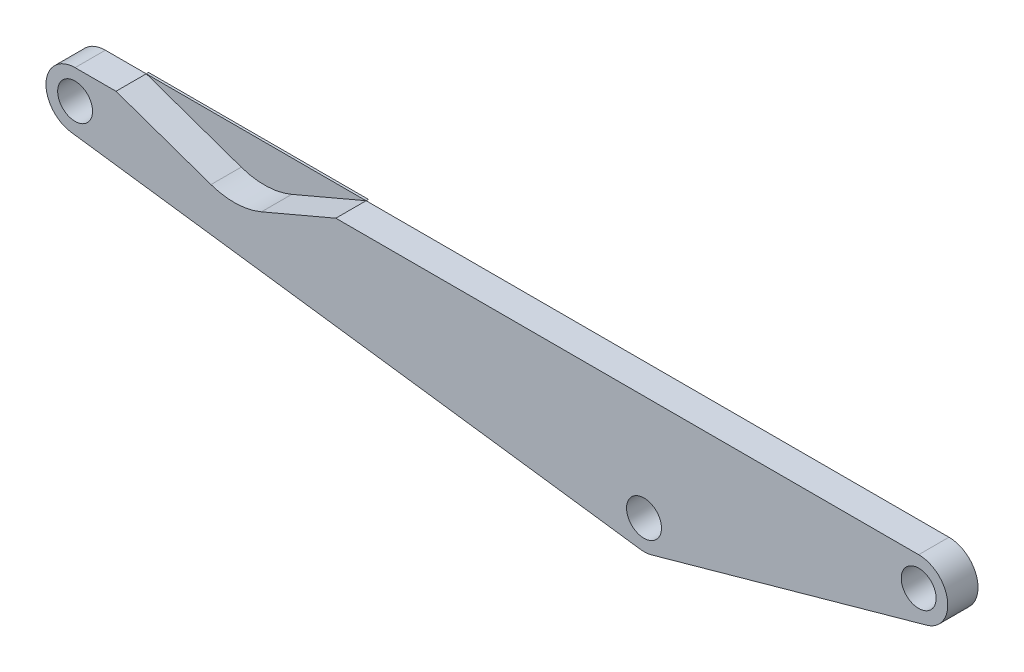
ISO-10303-21;
HEADER;
FILE_DESCRIPTION(('STEP AP214'),'2;1');
FILE_NAME('part.step','',(''),(''),'','','');
FILE_SCHEMA(('AUTOMOTIVE_DESIGN { 1 0 10303 214 1 1 1 1 }'));
ENDSEC;
DATA;
#1=APPLICATION_CONTEXT('core data for automotive mechanical design processes');
#2=APPLICATION_PROTOCOL_DEFINITION('international standard','automotive_design',2000,#1);
#3=PRODUCT_CONTEXT('',#1,'mechanical');
#4=PRODUCT('Part','Part','',(#3));
#5=PRODUCT_RELATED_PRODUCT_CATEGORY('part','',(#4));
#6=PRODUCT_DEFINITION_FORMATION('','',#4);
#7=PRODUCT_DEFINITION_CONTEXT('part definition',#1,'design');
#8=PRODUCT_DEFINITION('design','',#6,#7);
#9=PRODUCT_DEFINITION_SHAPE('','',#8);
#10=(LENGTH_UNIT() NAMED_UNIT(*) SI_UNIT(.MILLI.,.METRE.));
#11=(NAMED_UNIT(*) PLANE_ANGLE_UNIT() SI_UNIT($,.RADIAN.));
#12=(NAMED_UNIT(*) SI_UNIT($,.STERADIAN.) SOLID_ANGLE_UNIT());
#13=UNCERTAINTY_MEASURE_WITH_UNIT(LENGTH_MEASURE(1.E-05),#10,'distance_accuracy_value','');
#14=(GEOMETRIC_REPRESENTATION_CONTEXT(3) GLOBAL_UNCERTAINTY_ASSIGNED_CONTEXT((#13)) GLOBAL_UNIT_ASSIGNED_CONTEXT((#10,
#11,#12)) REPRESENTATION_CONTEXT('',''));
#15=CARTESIAN_POINT('',(0.,0.,0.));
#16=DIRECTION('',(0.,0.,1.));
#17=DIRECTION('',(1.,0.,0.));
#18=AXIS2_PLACEMENT_3D('',#15,#16,#17);
#19=CARTESIAN_POINT('',(1.75732914672943,1.25,-0.75));
#20=DIRECTION('',(0.,-1.,0.));
#21=DIRECTION('',(0.,0.,-1.));
#22=AXIS2_PLACEMENT_3D('',#19,#20,#21);
#23=PLANE('',#22);
#24=DIRECTION('',(1.,0.,0.));
#25=VECTOR('',#24,1.);
#26=CARTESIAN_POINT('',(1.75732914672943,1.25,-0.65));
#27=LINE('',#26,#25);
#28=CARTESIAN_POINT('',(1.75732914672943,1.25,-0.65));
#29=VERTEX_POINT('',#28);
#30=CARTESIAN_POINT('',(11.2021113101362,1.25,-0.65));
#31=VERTEX_POINT('',#30);
#32=EDGE_CURVE('E106',#29,#31,#27,.T.);
#33=ORIENTED_EDGE('',*,*,#32,.T.);
#34=DIRECTION('',(0.,0.,1.));
#35=VECTOR('',#34,1.);
#36=CARTESIAN_POINT('',(11.2021113101362,1.25,-0.75));
#37=LINE('',#36,#35);
#38=CARTESIAN_POINT('',(11.2021113101362,1.25,-0.75));
#39=VERTEX_POINT('',#38);
#40=EDGE_CURVE('E12',#39,#31,#37,.T.);
#41=ORIENTED_EDGE('',*,*,#40,.F.);
#42=DIRECTION('',(1.,0.,0.));
#43=VECTOR('',#42,1.);
#44=CARTESIAN_POINT('',(1.75732914672943,1.25,-0.75));
#45=LINE('',#44,#43);
#46=CARTESIAN_POINT('',(1.75732914672943,1.25,-0.75));
#47=VERTEX_POINT('',#46);
#48=EDGE_CURVE('E94',#47,#39,#45,.T.);
#49=ORIENTED_EDGE('',*,*,#48,.F.);
#50=DIRECTION('',(0.,0.,1.));
#51=VECTOR('',#50,1.);
#52=CARTESIAN_POINT('',(1.75732914672943,1.25,-0.75));
#53=LINE('',#52,#51);
#54=EDGE_CURVE('E102',#47,#29,#53,.T.);
#55=ORIENTED_EDGE('',*,*,#54,.T.);
#56=EDGE_LOOP('',(#33,#41,#49,#55));
#57=FACE_BOUND('',#56,.T.);
#58=ADVANCED_FACE('F43',(#57),#23,.F.);
#59=CARTESIAN_POINT('',(8.00623029335462,-0.111228877408158,-0.75));
#60=DIRECTION('',(-0.391867010734309,0.920021872510734,0.));
#61=DIRECTION('',(-0.920021872510734,-0.391867010734309,0.));
#62=AXIS2_PLACEMENT_3D('',#59,#60,#61);
#63=PLANE('',#62);
#64=DIRECTION('',(-0.920021872510734,-0.391867010734309,0.));
#65=VECTOR('',#64,1.);
#66=CARTESIAN_POINT('',(8.00623029335462,-0.111228877408158,-0.65));
#67=LINE('',#66,#65);
#68=CARTESIAN_POINT('',(8.00623029335462,-0.111228877408158,-0.65));
#69=VERTEX_POINT('',#68);
#70=EDGE_CURVE('E98',#31,#69,#67,.T.);
#71=ORIENTED_EDGE('',*,*,#70,.T.);
#72=DIRECTION('',(0.,0.,1.));
#73=VECTOR('',#72,1.);
#74=CARTESIAN_POINT('',(8.00623029335462,-0.111228877408158,-0.75));
#75=LINE('',#74,#73);
#76=CARTESIAN_POINT('',(8.00623029335462,-0.111228877408158,-0.75));
#77=VERTEX_POINT('',#76);
#78=EDGE_CURVE('E51',#77,#69,#75,.T.);
#79=ORIENTED_EDGE('',*,*,#78,.F.);
#80=DIRECTION('',(-0.920021872510734,-0.391867010734309,0.));
#81=VECTOR('',#80,1.);
#82=CARTESIAN_POINT('',(8.00623029335462,-0.111228877408158,-0.75));
#83=LINE('',#82,#81);
#84=EDGE_CURVE('E89',#39,#77,#83,.T.);
#85=ORIENTED_EDGE('',*,*,#84,.F.);
#86=ORIENTED_EDGE('',*,*,#40,.T.);
#87=EDGE_LOOP('',(#71,#79,#85,#86));
#88=FACE_BOUND('',#87,.T.);
#89=ADVANCED_FACE('F97',(#88),#63,.F.);
#90=CARTESIAN_POINT('',(6.83062926115168,2.64883674012404,-0.75));
#91=DIRECTION('',(0.,0.,1.));
#92=DIRECTION('',(1.,0.,0.));
#93=AXIS2_PLACEMENT_3D('',#90,#91,#92);
#94=CYLINDRICAL_SURFACE('',#93,3.);
#95=CARTESIAN_POINT('',(6.83062926115168,2.64883674012404,-0.65));
#96=DIRECTION('',(0.,0.,-1.));
#97=DIRECTION('',(-1.,0.,0.));
#98=AXIS2_PLACEMENT_3D('',#95,#96,#97);
#99=CIRCLE('',#98,3.);
#100=CARTESIAN_POINT('',(5.83713675970931,-0.181882717819079,-0.65));
#101=VERTEX_POINT('',#100);
#102=EDGE_CURVE('E76',#69,#101,#99,.T.);
#103=ORIENTED_EDGE('',*,*,#102,.T.);
#104=DIRECTION('',(0.,0.,1.));
#105=VECTOR('',#104,1.);
#106=CARTESIAN_POINT('',(5.83713675970931,-0.181882717819079,-0.75));
#107=LINE('',#106,#105);
#108=CARTESIAN_POINT('',(5.83713675970931,-0.181882717819079,-0.75));
#109=VERTEX_POINT('',#108);
#110=EDGE_CURVE('E99',#109,#101,#107,.T.);
#111=ORIENTED_EDGE('',*,*,#110,.F.);
#112=CARTESIAN_POINT('',(6.83062926115168,2.64883674012404,-0.75));
#113=DIRECTION('',(0.,0.,-1.));
#114=DIRECTION('',(-1.,0.,0.));
#115=AXIS2_PLACEMENT_3D('',#112,#113,#114);
#116=CIRCLE('',#115,3.);
#117=EDGE_CURVE('E92',#77,#109,#116,.T.);
#118=ORIENTED_EDGE('',*,*,#117,.F.);
#119=ORIENTED_EDGE('',*,*,#78,.T.);
#120=EDGE_LOOP('',(#103,#111,#118,#119));
#121=FACE_BOUND('',#120,.T.);
#122=ADVANCED_FACE('F100',(#121),#94,.T.);
#123=CARTESIAN_POINT('',(1.75732914672943,1.25,-0.75));
#124=DIRECTION('',(0.331164167147452,0.943573152647708,0.));
#125=DIRECTION('',(-0.943573152647708,0.331164167147452,0.));
#126=AXIS2_PLACEMENT_3D('',#123,#124,#125);
#127=PLANE('',#126);
#128=DIRECTION('',(-0.943573152647708,0.331164167147452,0.));
#129=VECTOR('',#128,1.);
#130=CARTESIAN_POINT('',(1.75732914672943,1.25,-0.65));
#131=LINE('',#130,#129);
#132=EDGE_CURVE('E82',#101,#29,#131,.T.);
#133=ORIENTED_EDGE('',*,*,#132,.T.);
#134=ORIENTED_EDGE('',*,*,#54,.F.);
#135=DIRECTION('',(-0.943573152647708,0.331164167147452,0.));
#136=VECTOR('',#135,1.);
#137=CARTESIAN_POINT('',(1.75732914672943,1.25,-0.75));
#138=LINE('',#137,#136);
#139=EDGE_CURVE('E59',#109,#47,#138,.T.);
#140=ORIENTED_EDGE('',*,*,#139,.F.);
#141=ORIENTED_EDGE('',*,*,#110,.T.);
#142=EDGE_LOOP('',(#133,#134,#140,#141));
#143=FACE_BOUND('',#142,.T.);
#144=ADVANCED_FACE('F113',(#143),#127,.F.);
#145=CARTESIAN_POINT('',(6.83062926115168,2.64883674012404,-0.75));
#146=DIRECTION('',(0.,0.,-1.));
#147=DIRECTION('',(-1.,0.,0.));
#148=AXIS2_PLACEMENT_3D('',#145,#146,#147);
#149=PLANE('',#148);
#150=ORIENTED_EDGE('',*,*,#48,.T.);
#151=ORIENTED_EDGE('',*,*,#84,.T.);
#152=ORIENTED_EDGE('',*,*,#117,.T.);
#153=ORIENTED_EDGE('',*,*,#139,.T.);
#154=EDGE_LOOP('',(#150,#151,#152,#153));
#155=FACE_BOUND('',#154,.T.);
#156=ADVANCED_FACE('F90',(#155),#149,.T.);
#157=CARTESIAN_POINT('',(6.83062926115168,2.64883674012404,-0.65));
#158=DIRECTION('',(0.,0.,-1.));
#159=DIRECTION('',(-1.,0.,0.));
#160=AXIS2_PLACEMENT_3D('',#157,#158,#159);
#161=PLANE('',#160);
#162=ORIENTED_EDGE('',*,*,#32,.F.);
#163=ORIENTED_EDGE('',*,*,#132,.F.);
#164=ORIENTED_EDGE('',*,*,#102,.F.);
#165=ORIENTED_EDGE('',*,*,#70,.F.);
#166=EDGE_LOOP('',(#162,#163,#164,#165));
#167=FACE_BOUND('',#166,.T.);
#168=ADVANCED_FACE('F116',(#167),#161,.F.);
#169=CLOSED_SHELL('',(#58,#89,#122,#144,#156,#168));
#170=MANIFOLD_SOLID_BREP('B2',#169);
#171=CARTESIAN_POINT('',(0.,1.25,0.65));
#172=DIRECTION('',(0.,-1.,0.));
#173=DIRECTION('',(0.,0.,-1.));
#174=AXIS2_PLACEMENT_3D('',#171,#172,#173);
#175=PLANE('',#174);
#176=DIRECTION('',(-1.,0.,0.));
#177=VECTOR('',#176,1.);
#178=CARTESIAN_POINT('',(0.,1.25,-0.65));
#179=LINE('',#178,#177);
#180=CARTESIAN_POINT('',(36.24,1.25,-0.65));
#181=VERTEX_POINT('',#180);
#182=CARTESIAN_POINT('',(11.2021113101362,1.25,-0.65));
#183=VERTEX_POINT('',#182);
#184=EDGE_CURVE('E272',#181,#183,#179,.T.);
#185=ORIENTED_EDGE('',*,*,#184,.T.);
#186=DIRECTION('',(0.,0.,1.));
#187=VECTOR('',#186,1.);
#188=CARTESIAN_POINT('',(11.2021113101362,1.25,0.65));
#189=LINE('',#188,#187);
#190=CARTESIAN_POINT('',(11.2021113101362,1.25,0.65));
#191=VERTEX_POINT('',#190);
#192=EDGE_CURVE('E175',#183,#191,#189,.T.);
#193=ORIENTED_EDGE('',*,*,#192,.T.);
#194=DIRECTION('',(-1.,0.,0.));
#195=VECTOR('',#194,1.);
#196=CARTESIAN_POINT('',(0.,1.25,0.65));
#197=LINE('',#196,#195);
#198=CARTESIAN_POINT('',(36.24,1.25,0.65));
#199=VERTEX_POINT('',#198);
#200=EDGE_CURVE('E227',#199,#191,#197,.T.);
#201=ORIENTED_EDGE('',*,*,#200,.F.);
#202=DIRECTION('',(0.,0.,-1.));
#203=VECTOR('',#202,1.);
#204=CARTESIAN_POINT('',(36.24,1.25,0.65));
#205=LINE('',#204,#203);
#206=EDGE_CURVE('E288',#199,#181,#205,.T.);
#207=ORIENTED_EDGE('',*,*,#206,.T.);
#208=EDGE_LOOP('',(#185,#193,#201,#207));
#209=FACE_BOUND('',#208,.T.);
#210=ADVANCED_FACE('F167',(#209),#175,.F.);
#211=CARTESIAN_POINT('',(36.24,0.,0.65));
#212=DIRECTION('',(0.,0.,1.));
#213=DIRECTION('',(1.,0.,0.));
#214=AXIS2_PLACEMENT_3D('',#211,#212,#213);
#215=PLANE('',#214);
#216=DIRECTION('',(0.920021872510734,0.391867010734309,0.));
#217=VECTOR('',#216,1.);
#218=CARTESIAN_POINT('',(8.00623029335462,-0.111228877408158,0.65));
#219=LINE('',#218,#217);
#220=CARTESIAN_POINT('',(8.00623029335462,-0.111228877408158,0.65));
#221=VERTEX_POINT('',#220);
#222=EDGE_CURVE('E301',#221,#191,#219,.T.);
#223=ORIENTED_EDGE('',*,*,#222,.F.);
#224=CARTESIAN_POINT('',(6.83062926115168,2.64883674012404,0.65));
#225=DIRECTION('',(0.,0.,1.));
#226=DIRECTION('',(1.,0.,0.));
#227=AXIS2_PLACEMENT_3D('',#224,#225,#226);
#228=CIRCLE('',#227,3.);
#229=CARTESIAN_POINT('',(5.83713675970931,-0.18188271781908,0.65));
#230=VERTEX_POINT('',#229);
#231=EDGE_CURVE('E335',#230,#221,#228,.T.);
#232=ORIENTED_EDGE('',*,*,#231,.F.);
#233=DIRECTION('',(0.943573152647708,-0.331164167147452,0.));
#234=VECTOR('',#233,1.);
#235=CARTESIAN_POINT('',(1.75732914672943,1.25,0.65));
#236=LINE('',#235,#234);
#237=CARTESIAN_POINT('',(1.75732914672943,1.25,0.65));
#238=VERTEX_POINT('',#237);
#239=EDGE_CURVE('E338',#238,#230,#236,.T.);
#240=ORIENTED_EDGE('',*,*,#239,.F.);
#241=CARTESIAN_POINT('',(0.,1.25,0.65));
#242=VERTEX_POINT('',#241);
#243=EDGE_CURVE('E304',#238,#242,#197,.T.);
#244=ORIENTED_EDGE('',*,*,#243,.T.);
#245=CARTESIAN_POINT('',(0.,0.,0.65));
#246=DIRECTION('',(0.,0.,1.));
#247=DIRECTION('',(1.,0.,0.));
#248=AXIS2_PLACEMENT_3D('',#245,#246,#247);
#249=CIRCLE('',#248,1.25);
#250=CARTESIAN_POINT('',(-0.166704286141232,-1.2388340005756,0.65));
#251=VERTEX_POINT('',#250);
#252=EDGE_CURVE('E246',#242,#251,#249,.T.);
#253=ORIENTED_EDGE('',*,*,#252,.T.);
#254=DIRECTION('',(0.991067200460479,-0.133363428912986,0.));
#255=VECTOR('',#254,1.);
#256=CARTESIAN_POINT('',(-0.166704286141232,-1.2388340005756,0.65));
#257=LINE('',#256,#255);
#258=CARTESIAN_POINT('',(24.2730128772142,-4.52757615756982,0.65));
#259=VERTEX_POINT('',#258);
#260=EDGE_CURVE('E237',#251,#259,#257,.T.);
#261=ORIENTED_EDGE('',*,*,#260,.T.);
#262=CARTESIAN_POINT('',(24.4397171633554,-3.28874215699422,0.65));
#263=DIRECTION('',(0.,0.,1.));
#264=DIRECTION('',(1.,0.,0.));
#265=AXIS2_PLACEMENT_3D('',#262,#263,#264);
#266=CIRCLE('',#265,1.25);
#267=CARTESIAN_POINT('',(24.7753030977426,-4.49285265052939,0.65));
#268=VERTEX_POINT('',#267);
#269=EDGE_CURVE('E243',#259,#268,#266,.T.);
#270=ORIENTED_EDGE('',*,*,#269,.T.);
#271=DIRECTION('',(0.96328839482813,0.268468747509733,0.));
#272=VECTOR('',#271,1.);
#273=CARTESIAN_POINT('',(24.7753030977426,-4.49285265052939,0.65));
#274=LINE('',#273,#272);
#275=CARTESIAN_POINT('',(36.5755859343872,-1.20411049353516,0.65));
#276=VERTEX_POINT('',#275);
#277=EDGE_CURVE('E191',#268,#276,#274,.T.);
#278=ORIENTED_EDGE('',*,*,#277,.T.);
#279=CARTESIAN_POINT('',(36.24,0.,0.65));
#280=DIRECTION('',(0.,0.,1.));
#281=DIRECTION('',(1.,0.,0.));
#282=AXIS2_PLACEMENT_3D('',#279,#280,#281);
#283=CIRCLE('',#282,1.25);
#284=EDGE_CURVE('E281',#276,#199,#283,.T.);
#285=ORIENTED_EDGE('',*,*,#284,.T.);
#286=ORIENTED_EDGE('',*,*,#200,.T.);
#287=EDGE_LOOP('',(#223,#232,#240,#244,#253,#261,#270,#278,#285,#286));
#288=FACE_BOUND('',#287,.T.);
#289=CARTESIAN_POINT('',(36.24,0.,0.65));
#290=DIRECTION('',(0.,0.,1.));
#291=DIRECTION('',(1.,0.,0.));
#292=AXIS2_PLACEMENT_3D('',#289,#290,#291);
#293=CIRCLE('',#292,0.749999999999999);
#294=CARTESIAN_POINT('',(36.99,0.,0.65));
#295=VERTEX_POINT('',#294);
#296=EDGE_CURVE('E311',#295,#295,#293,.T.);
#297=ORIENTED_EDGE('',*,*,#296,.F.);
#298=EDGE_LOOP('',(#297));
#299=FACE_BOUND('',#298,.T.);
#300=CARTESIAN_POINT('',(0.,0.,0.65));
#301=DIRECTION('',(0.,0.,1.));
#302=DIRECTION('',(1.,0.,0.));
#303=AXIS2_PLACEMENT_3D('',#300,#301,#302);
#304=CIRCLE('',#303,0.75);
#305=CARTESIAN_POINT('',(0.75,0.,0.65));
#306=VERTEX_POINT('',#305);
#307=EDGE_CURVE('E271',#306,#306,#304,.T.);
#308=ORIENTED_EDGE('',*,*,#307,.F.);
#309=EDGE_LOOP('',(#308));
#310=FACE_BOUND('',#309,.T.);
#311=CARTESIAN_POINT('',(24.4397171633554,-3.28874215699422,0.65));
#312=DIRECTION('',(0.,0.,1.));
#313=DIRECTION('',(1.,0.,0.));
#314=AXIS2_PLACEMENT_3D('',#311,#312,#313);
#315=CIRCLE('',#314,0.750000000000002);
#316=CARTESIAN_POINT('',(25.1897171633554,-3.28874215699422,0.65));
#317=VERTEX_POINT('',#316);
#318=EDGE_CURVE('E317',#317,#317,#315,.T.);
#319=ORIENTED_EDGE('',*,*,#318,.F.);
#320=EDGE_LOOP('',(#319));
#321=FACE_BOUND('',#320,.T.);
#322=ADVANCED_FACE('F240',(#288,#299,#310,#321),#215,.T.);
#323=CARTESIAN_POINT('',(36.24,0.,-0.65));
#324=DIRECTION('',(0.,0.,1.));
#325=DIRECTION('',(1.,0.,0.));
#326=AXIS2_PLACEMENT_3D('',#323,#324,#325);
#327=PLANE('',#326);
#328=CARTESIAN_POINT('',(6.83062926115168,2.64883674012404,-0.65));
#329=DIRECTION('',(0.,0.,1.));
#330=DIRECTION('',(1.,0.,0.));
#331=AXIS2_PLACEMENT_3D('',#328,#329,#330);
#332=CIRCLE('',#331,3.);
#333=CARTESIAN_POINT('',(5.83713675970931,-0.18188271781908,-0.65));
#334=VERTEX_POINT('',#333);
#335=CARTESIAN_POINT('',(8.00623029335462,-0.111228877408158,-0.65));
#336=VERTEX_POINT('',#335);
#337=EDGE_CURVE('E41',#334,#336,#332,.T.);
#338=ORIENTED_EDGE('',*,*,#337,.T.);
#339=DIRECTION('',(0.920021872510734,0.391867010734309,0.));
#340=VECTOR('',#339,1.);
#341=CARTESIAN_POINT('',(31.9445301933165,10.0848656983216,-0.65));
#342=LINE('',#341,#340);
#343=EDGE_CURVE('E323',#336,#183,#342,.T.);
#344=ORIENTED_EDGE('',*,*,#343,.T.);
#345=ORIENTED_EDGE('',*,*,#184,.F.);
#346=CARTESIAN_POINT('',(36.24,0.,-0.65));
#347=DIRECTION('',(0.,0.,1.));
#348=DIRECTION('',(1.,0.,0.));
#349=AXIS2_PLACEMENT_3D('',#346,#347,#348);
#350=CIRCLE('',#349,1.25);
#351=CARTESIAN_POINT('',(36.5755859343872,-1.20411049353516,-0.65));
#352=VERTEX_POINT('',#351);
#353=EDGE_CURVE('E267',#352,#181,#350,.T.);
#354=ORIENTED_EDGE('',*,*,#353,.F.);
#355=DIRECTION('',(0.96328839482813,0.268468747509733,0.));
#356=VECTOR('',#355,1.);
#357=CARTESIAN_POINT('',(24.7753030977426,-4.49285265052939,-0.65));
#358=LINE('',#357,#356);
#359=CARTESIAN_POINT('',(24.7753030977426,-4.49285265052939,-0.65));
#360=VERTEX_POINT('',#359);
#361=EDGE_CURVE('E218',#360,#352,#358,.T.);
#362=ORIENTED_EDGE('',*,*,#361,.F.);
#363=CARTESIAN_POINT('',(24.4397171633554,-3.28874215699422,-0.65));
#364=DIRECTION('',(0.,0.,1.));
#365=DIRECTION('',(1.,0.,0.));
#366=AXIS2_PLACEMENT_3D('',#363,#364,#365);
#367=CIRCLE('',#366,1.25);
#368=CARTESIAN_POINT('',(24.2730128772142,-4.52757615756982,-0.65));
#369=VERTEX_POINT('',#368);
#370=EDGE_CURVE('E278',#369,#360,#367,.T.);
#371=ORIENTED_EDGE('',*,*,#370,.F.);
#372=DIRECTION('',(0.991067200460479,-0.133363428912986,0.));
#373=VECTOR('',#372,1.);
#374=CARTESIAN_POINT('',(-0.166704286141232,-1.2388340005756,-0.65));
#375=LINE('',#374,#373);
#376=CARTESIAN_POINT('',(-0.166704286141232,-1.2388340005756,-0.65));
#377=VERTEX_POINT('',#376);
#378=EDGE_CURVE('E255',#377,#369,#375,.T.);
#379=ORIENTED_EDGE('',*,*,#378,.F.);
#380=CARTESIAN_POINT('',(0.,0.,-0.65));
#381=DIRECTION('',(0.,0.,1.));
#382=DIRECTION('',(1.,0.,0.));
#383=AXIS2_PLACEMENT_3D('',#380,#381,#382);
#384=CIRCLE('',#383,1.25);
#385=CARTESIAN_POINT('',(0.,1.25,-0.65));
#386=VERTEX_POINT('',#385);
#387=EDGE_CURVE('E275',#386,#377,#384,.T.);
#388=ORIENTED_EDGE('',*,*,#387,.F.);
#389=CARTESIAN_POINT('',(1.75732914672943,1.25,-0.65));
#390=VERTEX_POINT('',#389);
#391=EDGE_CURVE('E270',#390,#386,#179,.T.);
#392=ORIENTED_EDGE('',*,*,#391,.F.);
#393=DIRECTION('',(0.943573152647708,-0.331164167147452,0.));
#394=VECTOR('',#393,1.);
#395=CARTESIAN_POINT('',(32.8488926606842,-9.66214995627923,-0.65));
#396=LINE('',#395,#394);
#397=EDGE_CURVE('E182',#390,#334,#396,.T.);
#398=ORIENTED_EDGE('',*,*,#397,.T.);
#399=EDGE_LOOP('',(#338,#344,#345,#354,#362,#371,#379,#388,#392,#398));
#400=FACE_BOUND('',#399,.T.);
#401=CARTESIAN_POINT('',(0.,0.,-0.65));
#402=DIRECTION('',(0.,0.,1.));
#403=DIRECTION('',(1.,0.,0.));
#404=AXIS2_PLACEMENT_3D('',#401,#402,#403);
#405=CIRCLE('',#404,0.75);
#406=CARTESIAN_POINT('',(0.75,0.,-0.65));
#407=VERTEX_POINT('',#406);
#408=EDGE_CURVE('E308',#407,#407,#405,.T.);
#409=ORIENTED_EDGE('',*,*,#408,.T.);
#410=EDGE_LOOP('',(#409));
#411=FACE_BOUND('',#410,.T.);
#412=CARTESIAN_POINT('',(36.24,0.,-0.65));
#413=DIRECTION('',(0.,0.,1.));
#414=DIRECTION('',(1.,0.,0.));
#415=AXIS2_PLACEMENT_3D('',#412,#413,#414);
#416=CIRCLE('',#415,0.749999999999999);
#417=CARTESIAN_POINT('',(36.99,0.,-0.65));
#418=VERTEX_POINT('',#417);
#419=EDGE_CURVE('E314',#418,#418,#416,.T.);
#420=ORIENTED_EDGE('',*,*,#419,.T.);
#421=EDGE_LOOP('',(#420));
#422=FACE_BOUND('',#421,.T.);
#423=CARTESIAN_POINT('',(24.4397171633554,-3.28874215699422,-0.65));
#424=DIRECTION('',(0.,0.,1.));
#425=DIRECTION('',(1.,0.,0.));
#426=AXIS2_PLACEMENT_3D('',#423,#424,#425);
#427=CIRCLE('',#426,0.750000000000002);
#428=CARTESIAN_POINT('',(25.1897171633554,-3.28874215699422,-0.65));
#429=VERTEX_POINT('',#428);
#430=EDGE_CURVE('E320',#429,#429,#427,.T.);
#431=ORIENTED_EDGE('',*,*,#430,.T.);
#432=EDGE_LOOP('',(#431));
#433=FACE_BOUND('',#432,.T.);
#434=ADVANCED_FACE('F356',(#400,#411,#422,#433),#327,.F.);
#435=CARTESIAN_POINT('',(36.24,0.,0.65));
#436=DIRECTION('',(0.,0.,-1.));
#437=DIRECTION('',(-1.,0.,0.));
#438=AXIS2_PLACEMENT_3D('',#435,#436,#437);
#439=CYLINDRICAL_SURFACE('',#438,1.25);
#440=ORIENTED_EDGE('',*,*,#353,.T.);
#441=ORIENTED_EDGE('',*,*,#206,.F.);
#442=ORIENTED_EDGE('',*,*,#284,.F.);
#443=DIRECTION('',(0.,0.,-1.));
#444=VECTOR('',#443,1.);
#445=CARTESIAN_POINT('',(36.5755859343872,-1.20411049353516,0.65));
#446=LINE('',#445,#444);
#447=EDGE_CURVE('E263',#276,#352,#446,.T.);
#448=ORIENTED_EDGE('',*,*,#447,.T.);
#449=EDGE_LOOP('',(#440,#441,#442,#448));
#450=FACE_BOUND('',#449,.T.);
#451=ADVANCED_FACE('F169',(#450),#439,.T.);
#452=ORIENTED_EDGE('',*,*,#243,.F.);
#453=DIRECTION('',(0.,0.,-1.));
#454=VECTOR('',#453,1.);
#455=CARTESIAN_POINT('',(1.75732914672943,1.25,0.65));
#456=LINE('',#455,#454);
#457=EDGE_CURVE('E290',#238,#390,#456,.T.);
#458=ORIENTED_EDGE('',*,*,#457,.T.);
#459=ORIENTED_EDGE('',*,*,#391,.T.);
#460=DIRECTION('',(0.,0.,-1.));
#461=VECTOR('',#460,1.);
#462=CARTESIAN_POINT('',(0.,1.25,0.65));
#463=LINE('',#462,#461);
#464=EDGE_CURVE('E285',#242,#386,#463,.T.);
#465=ORIENTED_EDGE('',*,*,#464,.F.);
#466=EDGE_LOOP('',(#452,#458,#459,#465));
#467=FACE_BOUND('',#466,.T.);
#468=ADVANCED_FACE('F363',(#467),#175,.F.);
#469=CARTESIAN_POINT('',(0.,0.,0.65));
#470=DIRECTION('',(0.,0.,-1.));
#471=DIRECTION('',(-1.,0.,0.));
#472=AXIS2_PLACEMENT_3D('',#469,#470,#471);
#473=CYLINDRICAL_SURFACE('',#472,1.25);
#474=ORIENTED_EDGE('',*,*,#387,.T.);
#475=DIRECTION('',(0.,0.,-1.));
#476=VECTOR('',#475,1.);
#477=CARTESIAN_POINT('',(-0.166704286141232,-1.2388340005756,0.65));
#478=LINE('',#477,#476);
#479=EDGE_CURVE('E258',#251,#377,#478,.T.);
#480=ORIENTED_EDGE('',*,*,#479,.F.);
#481=ORIENTED_EDGE('',*,*,#252,.F.);
#482=ORIENTED_EDGE('',*,*,#464,.T.);
#483=EDGE_LOOP('',(#474,#480,#481,#482));
#484=FACE_BOUND('',#483,.T.);
#485=ADVANCED_FACE('F365',(#484),#473,.T.);
#486=CARTESIAN_POINT('',(-0.166704286141232,-1.2388340005756,0.65));
#487=DIRECTION('',(0.133363428912986,0.991067200460479,0.));
#488=DIRECTION('',(-0.991067200460479,0.133363428912986,0.));
#489=AXIS2_PLACEMENT_3D('',#486,#487,#488);
#490=PLANE('',#489);
#491=ORIENTED_EDGE('',*,*,#378,.T.);
#492=DIRECTION('',(0.,0.,-1.));
#493=VECTOR('',#492,1.);
#494=CARTESIAN_POINT('',(24.2730128772142,-4.52757615756982,0.65));
#495=LINE('',#494,#493);
#496=EDGE_CURVE('E252',#259,#369,#495,.T.);
#497=ORIENTED_EDGE('',*,*,#496,.F.);
#498=ORIENTED_EDGE('',*,*,#260,.F.);
#499=ORIENTED_EDGE('',*,*,#479,.T.);
#500=EDGE_LOOP('',(#491,#497,#498,#499));
#501=FACE_BOUND('',#500,.T.);
#502=ADVANCED_FACE('F253',(#501),#490,.F.);
#503=CARTESIAN_POINT('',(24.4397171633554,-3.28874215699422,0.65));
#504=DIRECTION('',(0.,0.,-1.));
#505=DIRECTION('',(-1.,0.,0.));
#506=AXIS2_PLACEMENT_3D('',#503,#504,#505);
#507=CYLINDRICAL_SURFACE('',#506,1.25);
#508=ORIENTED_EDGE('',*,*,#370,.T.);
#509=DIRECTION('',(0.,0.,-1.));
#510=VECTOR('',#509,1.);
#511=CARTESIAN_POINT('',(24.7753030977426,-4.49285265052939,0.65));
#512=LINE('',#511,#510);
#513=EDGE_CURVE('E259',#268,#360,#512,.T.);
#514=ORIENTED_EDGE('',*,*,#513,.F.);
#515=ORIENTED_EDGE('',*,*,#269,.F.);
#516=ORIENTED_EDGE('',*,*,#496,.T.);
#517=EDGE_LOOP('',(#508,#514,#515,#516));
#518=FACE_BOUND('',#517,.T.);
#519=ADVANCED_FACE('F261',(#518),#507,.T.);
#520=CARTESIAN_POINT('',(24.7753030977426,-4.49285265052939,0.65));
#521=DIRECTION('',(-0.268468747509733,0.96328839482813,0.));
#522=DIRECTION('',(-0.96328839482813,-0.268468747509733,0.));
#523=AXIS2_PLACEMENT_3D('',#520,#521,#522);
#524=PLANE('',#523);
#525=ORIENTED_EDGE('',*,*,#361,.T.);
#526=ORIENTED_EDGE('',*,*,#447,.F.);
#527=ORIENTED_EDGE('',*,*,#277,.F.);
#528=ORIENTED_EDGE('',*,*,#513,.T.);
#529=EDGE_LOOP('',(#525,#526,#527,#528));
#530=FACE_BOUND('',#529,.T.);
#531=ADVANCED_FACE('F366',(#530),#524,.F.);
#532=CARTESIAN_POINT('',(0.,0.,0.65));
#533=DIRECTION('',(0.,0.,-1.));
#534=DIRECTION('',(-1.,0.,0.));
#535=AXIS2_PLACEMENT_3D('',#532,#533,#534);
#536=CYLINDRICAL_SURFACE('',#535,0.75);
#537=ORIENTED_EDGE('',*,*,#307,.T.);
#538=EDGE_LOOP('',(#537));
#539=FACE_BOUND('',#538,.T.);
#540=ORIENTED_EDGE('',*,*,#408,.F.);
#541=EDGE_LOOP('',(#540));
#542=FACE_BOUND('',#541,.T.);
#543=ADVANCED_FACE('F387',(#539,#542),#536,.F.);
#544=CARTESIAN_POINT('',(36.24,0.,0.65));
#545=DIRECTION('',(0.,0.,-1.));
#546=DIRECTION('',(-1.,0.,0.));
#547=AXIS2_PLACEMENT_3D('',#544,#545,#546);
#548=CYLINDRICAL_SURFACE('',#547,0.749999999999999);
#549=ORIENTED_EDGE('',*,*,#296,.T.);
#550=EDGE_LOOP('',(#549));
#551=FACE_BOUND('',#550,.T.);
#552=ORIENTED_EDGE('',*,*,#419,.F.);
#553=EDGE_LOOP('',(#552));
#554=FACE_BOUND('',#553,.T.);
#555=ADVANCED_FACE('F391',(#551,#554),#548,.F.);
#556=CARTESIAN_POINT('',(24.4397171633554,-3.28874215699422,0.65));
#557=DIRECTION('',(0.,0.,-1.));
#558=DIRECTION('',(-1.,0.,0.));
#559=AXIS2_PLACEMENT_3D('',#556,#557,#558);
#560=CYLINDRICAL_SURFACE('',#559,0.750000000000002);
#561=ORIENTED_EDGE('',*,*,#318,.T.);
#562=EDGE_LOOP('',(#561));
#563=FACE_BOUND('',#562,.T.);
#564=ORIENTED_EDGE('',*,*,#430,.F.);
#565=EDGE_LOOP('',(#564));
#566=FACE_BOUND('',#565,.T.);
#567=ADVANCED_FACE('F395',(#563,#566),#560,.F.);
#568=CARTESIAN_POINT('',(6.83062926115168,2.64883674012404,-9.35));
#569=DIRECTION('',(0.,0.,1.));
#570=DIRECTION('',(1.,0.,0.));
#571=AXIS2_PLACEMENT_3D('',#568,#569,#570);
#572=CYLINDRICAL_SURFACE('',#571,3.);
#573=DIRECTION('',(0.,0.,1.));
#574=VECTOR('',#573,1.);
#575=CARTESIAN_POINT('',(5.83713675970931,-0.18188271781908,-9.35));
#576=LINE('',#575,#574);
#577=EDGE_CURVE('E329',#334,#230,#576,.T.);
#578=ORIENTED_EDGE('',*,*,#577,.T.);
#579=ORIENTED_EDGE('',*,*,#231,.T.);
#580=DIRECTION('',(0.,0.,1.));
#581=VECTOR('',#580,1.);
#582=CARTESIAN_POINT('',(8.00623029335462,-0.111228877408158,-9.35));
#583=LINE('',#582,#581);
#584=EDGE_CURVE('E328',#336,#221,#583,.T.);
#585=ORIENTED_EDGE('',*,*,#584,.F.);
#586=ORIENTED_EDGE('',*,*,#337,.F.);
#587=EDGE_LOOP('',(#578,#579,#585,#586));
#588=FACE_BOUND('',#587,.T.);
#589=ADVANCED_FACE('F348',(#588),#572,.F.);
#590=CARTESIAN_POINT('',(8.00623029335462,-0.111228877408158,-9.35));
#591=DIRECTION('',(0.391867010734309,-0.920021872510734,0.));
#592=DIRECTION('',(0.920021872510734,0.391867010734309,0.));
#593=AXIS2_PLACEMENT_3D('',#590,#591,#592);
#594=PLANE('',#593);
#595=ORIENTED_EDGE('',*,*,#584,.T.);
#596=ORIENTED_EDGE('',*,*,#222,.T.);
#597=ORIENTED_EDGE('',*,*,#192,.F.);
#598=ORIENTED_EDGE('',*,*,#343,.F.);
#599=EDGE_LOOP('',(#595,#596,#597,#598));
#600=FACE_BOUND('',#599,.T.);
#601=ADVANCED_FACE('F354',(#600),#594,.F.);
#602=CARTESIAN_POINT('',(1.75732914672943,1.25,-9.35));
#603=DIRECTION('',(-0.331164167147452,-0.943573152647708,0.));
#604=DIRECTION('',(0.943573152647708,-0.331164167147452,0.));
#605=AXIS2_PLACEMENT_3D('',#602,#603,#604);
#606=PLANE('',#605);
#607=ORIENTED_EDGE('',*,*,#457,.F.);
#608=ORIENTED_EDGE('',*,*,#239,.T.);
#609=ORIENTED_EDGE('',*,*,#577,.F.);
#610=ORIENTED_EDGE('',*,*,#397,.F.);
#611=EDGE_LOOP('',(#607,#608,#609,#610));
#612=FACE_BOUND('',#611,.T.);
#613=ADVANCED_FACE('F342',(#612),#606,.F.);
#614=CLOSED_SHELL('',(#210,#322,#434,#451,#468,#485,#502,#519,#531,#543,#555,#567,#589,#601,#613));
#615=MANIFOLD_SOLID_BREP('B6',#614);
#616=ADVANCED_BREP_SHAPE_REPRESENTATION('',(#18,#170,#615),#14);
#617=SHAPE_DEFINITION_REPRESENTATION(#9,#616);
ENDSEC;
END-ISO-10303-21;
